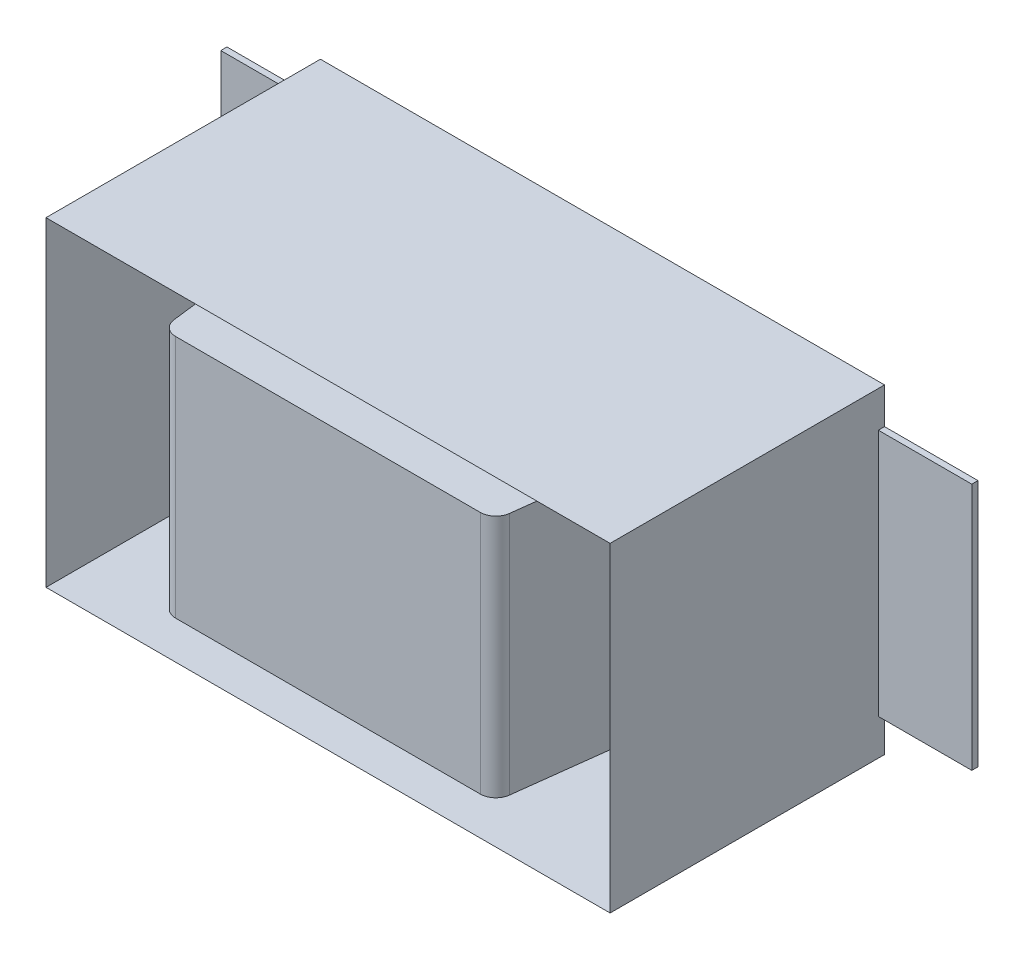
ISO-10303-21;
HEADER;
FILE_DESCRIPTION(('STEP AP214'),'2;1');
FILE_NAME('part.step','',(''),(''),'','','');
FILE_SCHEMA(('AUTOMOTIVE_DESIGN { 1 0 10303 214 1 1 1 1 }'));
ENDSEC;
DATA;
#1=APPLICATION_CONTEXT('core data for automotive mechanical design processes');
#2=APPLICATION_PROTOCOL_DEFINITION('international standard','automotive_design',2000,#1);
#3=PRODUCT_CONTEXT('',#1,'mechanical');
#4=PRODUCT('Part','Part','',(#3));
#5=PRODUCT_RELATED_PRODUCT_CATEGORY('part','',(#4));
#6=PRODUCT_DEFINITION_FORMATION('','',#4);
#7=PRODUCT_DEFINITION_CONTEXT('part definition',#1,'design');
#8=PRODUCT_DEFINITION('design','',#6,#7);
#9=PRODUCT_DEFINITION_SHAPE('','',#8);
#10=(LENGTH_UNIT() NAMED_UNIT(*) SI_UNIT(.MILLI.,.METRE.));
#11=(NAMED_UNIT(*) PLANE_ANGLE_UNIT() SI_UNIT($,.RADIAN.));
#12=(NAMED_UNIT(*) SI_UNIT($,.STERADIAN.) SOLID_ANGLE_UNIT());
#13=UNCERTAINTY_MEASURE_WITH_UNIT(LENGTH_MEASURE(1.E-05),#10,'distance_accuracy_value','');
#14=(GEOMETRIC_REPRESENTATION_CONTEXT(3) GLOBAL_UNCERTAINTY_ASSIGNED_CONTEXT((#13)) GLOBAL_UNIT_ASSIGNED_CONTEXT((#10,
#11,#12)) REPRESENTATION_CONTEXT('',''));
#15=CARTESIAN_POINT('',(0.,0.,0.));
#16=DIRECTION('',(0.,0.,1.));
#17=DIRECTION('',(1.,0.,0.));
#18=AXIS2_PLACEMENT_3D('',#15,#16,#17);
#19=CARTESIAN_POINT('',(1.2314936,0.4065016,0.0762));
#20=DIRECTION('',(0.,1.,0.));
#21=DIRECTION('',(1.,0.,0.));
#22=AXIS2_PLACEMENT_3D('',#19,#20,#21);
#23=PLANE('',#22);
#24=DIRECTION('',(0.,0.,1.));
#25=VECTOR('',#24,1.);
#26=CARTESIAN_POINT('',(0.3424936,0.4065016,0.0762));
#27=LINE('',#26,#25);
#28=CARTESIAN_POINT('',(0.3424936,0.4065016,0.0762));
#29=VERTEX_POINT('',#28);
#30=CARTESIAN_POINT('',(0.3424936,0.4065016,0.09652));
#31=VERTEX_POINT('',#30);
#32=EDGE_CURVE('P0_E326',#29,#31,#27,.T.);
#33=ORIENTED_EDGE('',*,*,#32,.T.);
#34=DIRECTION('',(-1.,0.,0.));
#35=VECTOR('',#34,1.);
#36=CARTESIAN_POINT('',(1.2314936,0.4065016,0.09652));
#37=LINE('',#36,#35);
#38=CARTESIAN_POINT('',(1.2314936,0.4065016,0.09652));
#39=VERTEX_POINT('',#38);
#40=EDGE_CURVE('P0_E285',#39,#31,#37,.T.);
#41=ORIENTED_EDGE('',*,*,#40,.F.);
#42=DIRECTION('',(0.,0.,1.));
#43=VECTOR('',#42,1.);
#44=CARTESIAN_POINT('',(1.2314936,0.4065016,0.0762));
#45=LINE('',#44,#43);
#46=CARTESIAN_POINT('',(1.2314936,0.4065016,0.0762));
#47=VERTEX_POINT('',#46);
#48=EDGE_CURVE('P0_E11',#47,#39,#45,.T.);
#49=ORIENTED_EDGE('',*,*,#48,.F.);
#50=DIRECTION('',(-1.,0.,0.));
#51=VECTOR('',#50,1.);
#52=CARTESIAN_POINT('',(1.2314936,0.4065016,0.0762));
#53=LINE('',#52,#51);
#54=EDGE_CURVE('P0_E259',#47,#29,#53,.T.);
#55=ORIENTED_EDGE('',*,*,#54,.T.);
#56=EDGE_LOOP('',(#33,#41,#49,#55));
#57=FACE_BOUND('',#56,.T.);
#58=ADVANCED_FACE('P0_F17',(#57),#23,.T.);
#59=CARTESIAN_POINT('',(1.2314936,-0.4065016,0.0762));
#60=DIRECTION('',(1.,0.,0.));
#61=DIRECTION('',(0.,1.,0.));
#62=AXIS2_PLACEMENT_3D('',#59,#60,#61);
#63=PLANE('',#62);
#64=ORIENTED_EDGE('',*,*,#48,.T.);
#65=DIRECTION('',(0.,1.,0.));
#66=VECTOR('',#65,1.);
#67=CARTESIAN_POINT('',(1.2314936,-0.4065016,0.09652));
#68=LINE('',#67,#66);
#69=CARTESIAN_POINT('',(1.2314936,-0.4065016,0.09652));
#70=VERTEX_POINT('',#69);
#71=EDGE_CURVE('P0_E290',#70,#39,#68,.T.);
#72=ORIENTED_EDGE('',*,*,#71,.F.);
#73=DIRECTION('',(0.,0.,1.));
#74=VECTOR('',#73,1.);
#75=CARTESIAN_POINT('',(1.2314936,-0.4065016,0.0762));
#76=LINE('',#75,#74);
#77=CARTESIAN_POINT('',(1.2314936,-0.4065016,0.0762));
#78=VERTEX_POINT('',#77);
#79=EDGE_CURVE('P0_E28',#78,#70,#76,.T.);
#80=ORIENTED_EDGE('',*,*,#79,.F.);
#81=DIRECTION('',(0.,1.,0.));
#82=VECTOR('',#81,1.);
#83=CARTESIAN_POINT('',(1.2314936,-0.4065016,0.0762));
#84=LINE('',#83,#82);
#85=EDGE_CURVE('P0_E263',#78,#47,#84,.T.);
#86=ORIENTED_EDGE('',*,*,#85,.T.);
#87=EDGE_LOOP('',(#64,#72,#80,#86));
#88=FACE_BOUND('',#87,.T.);
#89=ADVANCED_FACE('P0_F937',(#88),#63,.T.);
#90=CARTESIAN_POINT('',(0.3424936,-0.4065016,0.0762));
#91=DIRECTION('',(0.,-1.,0.));
#92=DIRECTION('',(0.,0.,-1.));
#93=AXIS2_PLACEMENT_3D('',#90,#91,#92);
#94=PLANE('',#93);
#95=ORIENTED_EDGE('',*,*,#79,.T.);
#96=DIRECTION('',(1.,0.,0.));
#97=VECTOR('',#96,1.);
#98=CARTESIAN_POINT('',(0.3424936,-0.4065016,0.09652));
#99=LINE('',#98,#97);
#100=CARTESIAN_POINT('',(0.3424936,-0.4065016,0.09652));
#101=VERTEX_POINT('',#100);
#102=EDGE_CURVE('P0_E291',#101,#70,#99,.T.);
#103=ORIENTED_EDGE('',*,*,#102,.F.);
#104=DIRECTION('',(0.,0.,1.));
#105=VECTOR('',#104,1.);
#106=CARTESIAN_POINT('',(0.3424936,-0.4065016,0.0762));
#107=LINE('',#106,#105);
#108=CARTESIAN_POINT('',(0.3424936,-0.4065016,0.0762));
#109=VERTEX_POINT('',#108);
#110=EDGE_CURVE('P0_E330',#109,#101,#107,.T.);
#111=ORIENTED_EDGE('',*,*,#110,.F.);
#112=DIRECTION('',(1.,0.,0.));
#113=VECTOR('',#112,1.);
#114=CARTESIAN_POINT('',(0.3424936,-0.4065016,0.0762));
#115=LINE('',#114,#113);
#116=EDGE_CURVE('P0_E383',#109,#78,#115,.T.);
#117=ORIENTED_EDGE('',*,*,#116,.T.);
#118=EDGE_LOOP('',(#95,#103,#111,#117));
#119=FACE_BOUND('',#118,.T.);
#120=ADVANCED_FACE('P0_F922',(#119),#94,.T.);
#121=CARTESIAN_POINT('',(0.3424936,0.4065016,0.0762));
#122=DIRECTION('',(-1.,0.,0.));
#123=DIRECTION('',(0.,0.,1.));
#124=AXIS2_PLACEMENT_3D('',#121,#122,#123);
#125=PLANE('',#124);
#126=DIRECTION('',(0.,-1.,0.));
#127=VECTOR('',#126,1.);
#128=CARTESIAN_POINT('',(0.3424936,0.4065016,0.09652));
#129=LINE('',#128,#127);
#130=CARTESIAN_POINT('',(0.3424936,0.4,0.09652));
#131=VERTEX_POINT('',#130);
#132=EDGE_CURVE('P0_E289',#31,#131,#129,.T.);
#133=ORIENTED_EDGE('',*,*,#132,.F.);
#134=ORIENTED_EDGE('',*,*,#32,.F.);
#135=DIRECTION('',(0.,-1.,0.));
#136=VECTOR('',#135,1.);
#137=CARTESIAN_POINT('',(0.3424936,0.4065016,0.0762));
#138=LINE('',#137,#136);
#139=CARTESIAN_POINT('',(0.3424936,0.4,0.0762));
#140=VERTEX_POINT('',#139);
#141=EDGE_CURVE('P0_E264',#29,#140,#138,.T.);
#142=ORIENTED_EDGE('',*,*,#141,.T.);
#143=DIRECTION('',(0.,0.,1.));
#144=VECTOR('',#143,1.);
#145=CARTESIAN_POINT('',(0.3424936,0.4,0.0762));
#146=LINE('',#145,#144);
#147=EDGE_CURVE('P0_E237',#140,#131,#146,.T.);
#148=ORIENTED_EDGE('',*,*,#147,.T.);
#149=EDGE_LOOP('',(#133,#134,#142,#148));
#150=FACE_BOUND('',#149,.T.);
#151=ADVANCED_FACE('P0_F426',(#150),#125,.T.);
#152=CARTESIAN_POINT('',(0.3424936,0.4065016,0.0762));
#153=DIRECTION('',(-1.,0.,0.));
#154=DIRECTION('',(0.,0.,1.));
#155=AXIS2_PLACEMENT_3D('',#152,#153,#154);
#156=PLANE('',#155);
#157=DIRECTION('',(0.,-1.,0.));
#158=VECTOR('',#157,1.);
#159=CARTESIAN_POINT('',(0.3424936,-0.4,0.0762));
#160=LINE('',#159,#158);
#161=CARTESIAN_POINT('',(0.3424936,-0.4,0.0762));
#162=VERTEX_POINT('',#161);
#163=EDGE_CURVE('P0_E355',#162,#109,#160,.T.);
#164=ORIENTED_EDGE('',*,*,#163,.T.);
#165=ORIENTED_EDGE('',*,*,#110,.T.);
#166=DIRECTION('',(0.,-1.,0.));
#167=VECTOR('',#166,1.);
#168=CARTESIAN_POINT('',(0.3424936,-0.4,0.09652));
#169=LINE('',#168,#167);
#170=CARTESIAN_POINT('',(0.3424936,-0.4,0.09652));
#171=VERTEX_POINT('',#170);
#172=EDGE_CURVE('P0_E295',#171,#101,#169,.T.);
#173=ORIENTED_EDGE('',*,*,#172,.F.);
#174=DIRECTION('',(0.,0.,1.));
#175=VECTOR('',#174,1.);
#176=CARTESIAN_POINT('',(0.3424936,-0.4,0.0762));
#177=LINE('',#176,#175);
#178=EDGE_CURVE('P0_E222',#162,#171,#177,.T.);
#179=ORIENTED_EDGE('',*,*,#178,.F.);
#180=EDGE_LOOP('',(#164,#165,#173,#179));
#181=FACE_BOUND('',#180,.T.);
#182=ADVANCED_FACE('P0_F490',(#181),#156,.T.);
#183=CARTESIAN_POINT('',(-1.2314936,-0.4065016,0.0762));
#184=DIRECTION('',(0.,-1.,0.));
#185=DIRECTION('',(0.,0.,-1.));
#186=AXIS2_PLACEMENT_3D('',#183,#184,#185);
#187=PLANE('',#186);
#188=DIRECTION('',(0.,0.,1.));
#189=VECTOR('',#188,1.);
#190=CARTESIAN_POINT('',(-0.3424936,-0.4065016,0.0762));
#191=LINE('',#190,#189);
#192=CARTESIAN_POINT('',(-0.3424936,-0.4065016,0.0762));
#193=VERTEX_POINT('',#192);
#194=CARTESIAN_POINT('',(-0.3424936,-0.4065016,0.09652));
#195=VERTEX_POINT('',#194);
#196=EDGE_CURVE('P0_E302',#193,#195,#191,.T.);
#197=ORIENTED_EDGE('',*,*,#196,.T.);
#198=DIRECTION('',(1.,0.,0.));
#199=VECTOR('',#198,1.);
#200=CARTESIAN_POINT('',(-1.2314936,-0.4065016,0.09652));
#201=LINE('',#200,#199);
#202=CARTESIAN_POINT('',(-1.2314936,-0.4065016,0.09652));
#203=VERTEX_POINT('',#202);
#204=EDGE_CURVE('P0_E314',#203,#195,#201,.T.);
#205=ORIENTED_EDGE('',*,*,#204,.F.);
#206=DIRECTION('',(0.,0.,1.));
#207=VECTOR('',#206,1.);
#208=CARTESIAN_POINT('',(-1.2314936,-0.4065016,0.0762));
#209=LINE('',#208,#207);
#210=CARTESIAN_POINT('',(-1.2314936,-0.4065016,0.0762));
#211=VERTEX_POINT('',#210);
#212=EDGE_CURVE('P0_E213',#211,#203,#209,.T.);
#213=ORIENTED_EDGE('',*,*,#212,.F.);
#214=DIRECTION('',(1.,0.,0.));
#215=VECTOR('',#214,1.);
#216=CARTESIAN_POINT('',(-1.2314936,-0.4065016,0.0762));
#217=LINE('',#216,#215);
#218=EDGE_CURVE('P0_E346',#211,#193,#217,.T.);
#219=ORIENTED_EDGE('',*,*,#218,.T.);
#220=EDGE_LOOP('',(#197,#205,#213,#219));
#221=FACE_BOUND('',#220,.T.);
#222=ADVANCED_FACE('P0_F1021',(#221),#187,.T.);
#223=CARTESIAN_POINT('',(-1.2314936,0.4065016,0.0762));
#224=DIRECTION('',(-1.,0.,0.));
#225=DIRECTION('',(0.,0.,1.));
#226=AXIS2_PLACEMENT_3D('',#223,#224,#225);
#227=PLANE('',#226);
#228=ORIENTED_EDGE('',*,*,#212,.T.);
#229=DIRECTION('',(0.,-1.,0.));
#230=VECTOR('',#229,1.);
#231=CARTESIAN_POINT('',(-1.2314936,0.4065016,0.09652));
#232=LINE('',#231,#230);
#233=CARTESIAN_POINT('',(-1.2314936,0.4065016,0.09652));
#234=VERTEX_POINT('',#233);
#235=EDGE_CURVE('P0_E359',#234,#203,#232,.T.);
#236=ORIENTED_EDGE('',*,*,#235,.F.);
#237=DIRECTION('',(0.,0.,1.));
#238=VECTOR('',#237,1.);
#239=CARTESIAN_POINT('',(-1.2314936,0.4065016,0.0762));
#240=LINE('',#239,#238);
#241=CARTESIAN_POINT('',(-1.2314936,0.4065016,0.0762));
#242=VERTEX_POINT('',#241);
#243=EDGE_CURVE('P0_E41',#242,#234,#240,.T.);
#244=ORIENTED_EDGE('',*,*,#243,.F.);
#245=DIRECTION('',(0.,-1.,0.));
#246=VECTOR('',#245,1.);
#247=CARTESIAN_POINT('',(-1.2314936,0.4065016,0.0762));
#248=LINE('',#247,#246);
#249=EDGE_CURVE('P0_E338',#242,#211,#248,.T.);
#250=ORIENTED_EDGE('',*,*,#249,.T.);
#251=EDGE_LOOP('',(#228,#236,#244,#250));
#252=FACE_BOUND('',#251,.T.);
#253=ADVANCED_FACE('P0_F1016',(#252),#227,.T.);
#254=CARTESIAN_POINT('',(-0.3424936,0.4065016,0.0762));
#255=DIRECTION('',(0.,1.,0.));
#256=DIRECTION('',(1.,0.,0.));
#257=AXIS2_PLACEMENT_3D('',#254,#255,#256);
#258=PLANE('',#257);
#259=ORIENTED_EDGE('',*,*,#243,.T.);
#260=DIRECTION('',(-1.,0.,0.));
#261=VECTOR('',#260,1.);
#262=CARTESIAN_POINT('',(-0.3424936,0.4065016,0.09652));
#263=LINE('',#262,#261);
#264=CARTESIAN_POINT('',(-0.3424936,0.4065016,0.09652));
#265=VERTEX_POINT('',#264);
#266=EDGE_CURVE('P0_E362',#265,#234,#263,.T.);
#267=ORIENTED_EDGE('',*,*,#266,.F.);
#268=DIRECTION('',(0.,0.,1.));
#269=VECTOR('',#268,1.);
#270=CARTESIAN_POINT('',(-0.3424936,0.4065016,0.0762));
#271=LINE('',#270,#269);
#272=CARTESIAN_POINT('',(-0.3424936,0.4065016,0.0762));
#273=VERTEX_POINT('',#272);
#274=EDGE_CURVE('P0_E307',#273,#265,#271,.T.);
#275=ORIENTED_EDGE('',*,*,#274,.F.);
#276=DIRECTION('',(-1.,0.,0.));
#277=VECTOR('',#276,1.);
#278=CARTESIAN_POINT('',(-0.3424936,0.4065016,0.0762));
#279=LINE('',#278,#277);
#280=EDGE_CURVE('P0_E214',#273,#242,#279,.T.);
#281=ORIENTED_EDGE('',*,*,#280,.T.);
#282=EDGE_LOOP('',(#259,#267,#275,#281));
#283=FACE_BOUND('',#282,.T.);
#284=ADVANCED_FACE('P0_F1002',(#283),#258,.T.);
#285=CARTESIAN_POINT('',(0.8,-0.4,0.0762));
#286=DIRECTION('',(0.,0.,-1.));
#287=DIRECTION('',(0.,-1.,0.));
#288=AXIS2_PLACEMENT_3D('',#285,#286,#287);
#289=PLANE('',#288);
#290=ORIENTED_EDGE('',*,*,#141,.F.);
#291=ORIENTED_EDGE('',*,*,#54,.F.);
#292=ORIENTED_EDGE('',*,*,#85,.F.);
#293=ORIENTED_EDGE('',*,*,#116,.F.);
#294=ORIENTED_EDGE('',*,*,#163,.F.);
#295=DIRECTION('',(-1.,0.,0.));
#296=VECTOR('',#295,1.);
#297=CARTESIAN_POINT('',(0.3424936,-0.4,0.0762));
#298=LINE('',#297,#296);
#299=CARTESIAN_POINT('',(-0.3424936,-0.4,0.0762));
#300=VERTEX_POINT('',#299);
#301=EDGE_CURVE('P0_E227',#162,#300,#298,.T.);
#302=ORIENTED_EDGE('',*,*,#301,.T.);
#303=DIRECTION('',(0.,1.,0.));
#304=VECTOR('',#303,1.);
#305=CARTESIAN_POINT('',(-0.3424936,-0.4065016,0.0762));
#306=LINE('',#305,#304);
#307=EDGE_CURVE('P0_E308',#193,#300,#306,.T.);
#308=ORIENTED_EDGE('',*,*,#307,.F.);
#309=ORIENTED_EDGE('',*,*,#218,.F.);
#310=ORIENTED_EDGE('',*,*,#249,.F.);
#311=ORIENTED_EDGE('',*,*,#280,.F.);
#312=DIRECTION('',(0.,1.,0.));
#313=VECTOR('',#312,1.);
#314=CARTESIAN_POINT('',(-0.3424936,0.4,0.0762));
#315=LINE('',#314,#313);
#316=CARTESIAN_POINT('',(-0.3424936,0.4,0.0762));
#317=VERTEX_POINT('',#316);
#318=EDGE_CURVE('P0_E303',#317,#273,#315,.T.);
#319=ORIENTED_EDGE('',*,*,#318,.F.);
#320=DIRECTION('',(-1.,0.,0.));
#321=VECTOR('',#320,1.);
#322=CARTESIAN_POINT('',(0.3424936,0.4,0.0762));
#323=LINE('',#322,#321);
#324=EDGE_CURVE('P0_E280',#140,#317,#323,.T.);
#325=ORIENTED_EDGE('',*,*,#324,.F.);
#326=EDGE_LOOP('',(#290,#291,#292,#293,#294,#302,#308,#309,#310,#311,#319,#325));
#327=FACE_BOUND('',#326,.T.);
#328=ADVANCED_FACE('P0_F430',(#327),#289,.T.);
#329=CARTESIAN_POINT('',(-0.3424936,-0.4065016,0.0762));
#330=DIRECTION('',(1.,0.,0.));
#331=DIRECTION('',(0.,1.,0.));
#332=AXIS2_PLACEMENT_3D('',#329,#330,#331);
#333=PLANE('',#332);
#334=ORIENTED_EDGE('',*,*,#318,.T.);
#335=ORIENTED_EDGE('',*,*,#274,.T.);
#336=DIRECTION('',(0.,1.,0.));
#337=VECTOR('',#336,1.);
#338=CARTESIAN_POINT('',(-0.3424936,0.4,0.09652));
#339=LINE('',#338,#337);
#340=CARTESIAN_POINT('',(-0.3424936,0.4,0.09652));
#341=VERTEX_POINT('',#340);
#342=EDGE_CURVE('P0_E325',#341,#265,#339,.T.);
#343=ORIENTED_EDGE('',*,*,#342,.F.);
#344=DIRECTION('',(0.,0.,1.));
#345=VECTOR('',#344,1.);
#346=CARTESIAN_POINT('',(-0.3424936,0.4,0.0762));
#347=LINE('',#346,#345);
#348=EDGE_CURVE('P0_E284',#317,#341,#347,.T.);
#349=ORIENTED_EDGE('',*,*,#348,.F.);
#350=EDGE_LOOP('',(#334,#335,#343,#349));
#351=FACE_BOUND('',#350,.T.);
#352=ADVANCED_FACE('P0_F1001',(#351),#333,.T.);
#353=CARTESIAN_POINT('',(-0.3424936,-0.4065016,0.0762));
#354=DIRECTION('',(1.,0.,0.));
#355=DIRECTION('',(0.,1.,0.));
#356=AXIS2_PLACEMENT_3D('',#353,#354,#355);
#357=PLANE('',#356);
#358=DIRECTION('',(0.,1.,0.));
#359=VECTOR('',#358,1.);
#360=CARTESIAN_POINT('',(-0.3424936,-0.4065016,0.09652));
#361=LINE('',#360,#359);
#362=CARTESIAN_POINT('',(-0.3424936,-0.4,0.09652));
#363=VERTEX_POINT('',#362);
#364=EDGE_CURVE('P0_E255',#195,#363,#361,.T.);
#365=ORIENTED_EDGE('',*,*,#364,.F.);
#366=ORIENTED_EDGE('',*,*,#196,.F.);
#367=ORIENTED_EDGE('',*,*,#307,.T.);
#368=DIRECTION('',(0.,0.,1.));
#369=VECTOR('',#368,1.);
#370=CARTESIAN_POINT('',(-0.3424936,-0.4,0.0762));
#371=LINE('',#370,#369);
#372=EDGE_CURVE('P0_E242',#300,#363,#371,.T.);
#373=ORIENTED_EDGE('',*,*,#372,.T.);
#374=EDGE_LOOP('',(#365,#366,#367,#373));
#375=FACE_BOUND('',#374,.T.);
#376=ADVANCED_FACE('P0_F19',(#375),#357,.T.);
#377=CARTESIAN_POINT('',(0.,0.4,0.0762));
#378=DIRECTION('',(0.,1.,0.));
#379=DIRECTION('',(1.,0.,0.));
#380=AXIS2_PLACEMENT_3D('',#377,#378,#379);
#381=PLANE('',#380);
#382=ORIENTED_EDGE('',*,*,#147,.F.);
#383=ORIENTED_EDGE('',*,*,#324,.T.);
#384=ORIENTED_EDGE('',*,*,#348,.T.);
#385=DIRECTION('',(-1.,0.,0.));
#386=VECTOR('',#385,1.);
#387=CARTESIAN_POINT('',(-0.3424936,0.4,0.09652));
#388=LINE('',#387,#386);
#389=CARTESIAN_POINT('',(-0.8,0.4,0.09652));
#390=VERTEX_POINT('',#389);
#391=EDGE_CURVE('P0_E321',#341,#390,#388,.T.);
#392=ORIENTED_EDGE('',*,*,#391,.T.);
#393=DIRECTION('',(0.,0.,1.));
#394=VECTOR('',#393,1.);
#395=CARTESIAN_POINT('',(-0.8,0.4,0.09652));
#396=LINE('',#395,#394);
#397=CARTESIAN_POINT('',(-0.8,0.4,0.5262));
#398=VERTEX_POINT('',#397);
#399=EDGE_CURVE('P0_E234',#390,#398,#396,.T.);
#400=ORIENTED_EDGE('',*,*,#399,.T.);
#401=DIRECTION('',(1.,0.,0.));
#402=VECTOR('',#401,1.);
#403=CARTESIAN_POINT('',(-0.8,0.4,0.5262));
#404=LINE('',#403,#402);
#405=CARTESIAN_POINT('',(-0.6,0.4,0.5262));
#406=VERTEX_POINT('',#405);
#407=EDGE_CURVE('P0_E269',#398,#406,#404,.T.);
#408=ORIENTED_EDGE('',*,*,#407,.T.);
#409=DIRECTION('',(0.122402128164196,0.,0.992480588737571));
#410=VECTOR('',#409,1.);
#411=CARTESIAN_POINT('',(-0.6,0.4,0.5262));
#412=LINE('',#411,#410);
#413=CARTESIAN_POINT('',(-0.55,0.4,0.9316180281107));
#414=VERTEX_POINT('',#413);
#415=EDGE_CURVE('P0_E270',#406,#414,#412,.T.);
#416=ORIENTED_EDGE('',*,*,#415,.T.);
#417=CARTESIAN_POINT('',(-0.4995819860921,0.4,0.9254));
#418=DIRECTION('',(0.,1.,0.));
#419=DIRECTION('',(-0.992480588737571,0.,0.122402128164196));
#420=AXIS2_PLACEMENT_3D('',#417,#418,#419);
#421=CIRCLE('',#420,0.0508);
#422=CARTESIAN_POINT('',(-0.4995819860921,0.4,0.9762));
#423=VERTEX_POINT('',#422);
#424=EDGE_CURVE('P0_E179',#414,#423,#421,.T.);
#425=ORIENTED_EDGE('',*,*,#424,.T.);
#426=DIRECTION('',(1.,0.,0.));
#427=VECTOR('',#426,1.);
#428=CARTESIAN_POINT('',(-0.4995819860921,0.4,0.9762));
#429=LINE('',#428,#427);
#430=CARTESIAN_POINT('',(0.4995819860921,0.4,0.9762));
#431=VERTEX_POINT('',#430);
#432=EDGE_CURVE('P0_E170',#423,#431,#429,.T.);
#433=ORIENTED_EDGE('',*,*,#432,.T.);
#434=CARTESIAN_POINT('',(0.4995819860921,0.4,0.9254));
#435=DIRECTION('',(0.,1.,0.));
#436=DIRECTION('',(0.,0.,1.));
#437=AXIS2_PLACEMENT_3D('',#434,#435,#436);
#438=CIRCLE('',#437,0.0508);
#439=CARTESIAN_POINT('',(0.55,0.4,0.9316180281107));
#440=VERTEX_POINT('',#439);
#441=EDGE_CURVE('P0_E176',#431,#440,#438,.T.);
#442=ORIENTED_EDGE('',*,*,#441,.T.);
#443=DIRECTION('',(0.122402128164196,0.,-0.992480588737571));
#444=VECTOR('',#443,1.);
#445=CARTESIAN_POINT('',(0.55,0.4,0.9316180281107));
#446=LINE('',#445,#444);
#447=CARTESIAN_POINT('',(0.6,0.4,0.5262));
#448=VERTEX_POINT('',#447);
#449=EDGE_CURVE('P0_E207',#440,#448,#446,.T.);
#450=ORIENTED_EDGE('',*,*,#449,.T.);
#451=DIRECTION('',(1.,0.,0.));
#452=VECTOR('',#451,1.);
#453=CARTESIAN_POINT('',(0.6,0.4,0.5262));
#454=LINE('',#453,#452);
#455=CARTESIAN_POINT('',(0.8,0.4,0.5262));
#456=VERTEX_POINT('',#455);
#457=EDGE_CURVE('P0_E232',#448,#456,#454,.T.);
#458=ORIENTED_EDGE('',*,*,#457,.T.);
#459=DIRECTION('',(0.,0.,-1.));
#460=VECTOR('',#459,1.);
#461=CARTESIAN_POINT('',(0.8,0.4,0.5262));
#462=LINE('',#461,#460);
#463=CARTESIAN_POINT('',(0.8,0.4,0.09652));
#464=VERTEX_POINT('',#463);
#465=EDGE_CURVE('P0_E233',#456,#464,#462,.T.);
#466=ORIENTED_EDGE('',*,*,#465,.T.);
#467=DIRECTION('',(-1.,0.,0.));
#468=VECTOR('',#467,1.);
#469=CARTESIAN_POINT('',(0.8,0.4,0.09652));
#470=LINE('',#469,#468);
#471=EDGE_CURVE('P0_E252',#464,#131,#470,.T.);
#472=ORIENTED_EDGE('',*,*,#471,.T.);
#473=EDGE_LOOP('',(#382,#383,#384,#392,#400,#408,#416,#425,#433,#442,#450,#458,#466,#472));
#474=FACE_BOUND('',#473,.T.);
#475=ADVANCED_FACE('P0_F173',(#474),#381,.T.);
#476=CARTESIAN_POINT('',(-0.8,-0.4,0.0762));
#477=DIRECTION('',(-1.,0.,0.));
#478=DIRECTION('',(0.,0.,1.));
#479=AXIS2_PLACEMENT_3D('',#476,#477,#478);
#480=PLANE('',#479);
#481=DIRECTION('',(0.,0.,1.));
#482=VECTOR('',#481,1.);
#483=CARTESIAN_POINT('',(-0.8,-0.4,0.09652));
#484=LINE('',#483,#482);
#485=CARTESIAN_POINT('',(-0.8,-0.4,0.09652));
#486=VERTEX_POINT('',#485);
#487=CARTESIAN_POINT('',(-0.8,-0.4,0.5262));
#488=VERTEX_POINT('',#487);
#489=EDGE_CURVE('P0_E21',#486,#488,#484,.T.);
#490=ORIENTED_EDGE('',*,*,#489,.T.);
#491=DIRECTION('',(0.,1.,0.));
#492=VECTOR('',#491,1.);
#493=CARTESIAN_POINT('',(-0.8,-0.4,0.5262));
#494=LINE('',#493,#492);
#495=EDGE_CURVE('P0_E238',#488,#398,#494,.T.);
#496=ORIENTED_EDGE('',*,*,#495,.T.);
#497=ORIENTED_EDGE('',*,*,#399,.F.);
#498=DIRECTION('',(0.,1.,0.));
#499=VECTOR('',#498,1.);
#500=CARTESIAN_POINT('',(-0.8,-0.4,0.09652));
#501=LINE('',#500,#499);
#502=EDGE_CURVE('P0_E251',#486,#390,#501,.T.);
#503=ORIENTED_EDGE('',*,*,#502,.F.);
#504=EDGE_LOOP('',(#490,#496,#497,#503));
#505=FACE_BOUND('',#504,.T.);
#506=ADVANCED_FACE('P0_F515',(#505),#480,.T.);
#507=CARTESIAN_POINT('',(-0.8,-0.4,0.5262));
#508=DIRECTION('',(0.,0.,1.));
#509=DIRECTION('',(1.,0.,0.));
#510=AXIS2_PLACEMENT_3D('',#507,#508,#509);
#511=PLANE('',#510);
#512=DIRECTION('',(0.,1.,0.));
#513=VECTOR('',#512,1.);
#514=CARTESIAN_POINT('',(-0.6,-0.4,0.5262));
#515=LINE('',#514,#513);
#516=CARTESIAN_POINT('',(-0.6,-0.4,0.5262));
#517=VERTEX_POINT('',#516);
#518=EDGE_CURVE('P0_E265',#517,#406,#515,.T.);
#519=ORIENTED_EDGE('',*,*,#518,.T.);
#520=ORIENTED_EDGE('',*,*,#407,.F.);
#521=ORIENTED_EDGE('',*,*,#495,.F.);
#522=DIRECTION('',(1.,0.,0.));
#523=VECTOR('',#522,1.);
#524=CARTESIAN_POINT('',(-0.8,-0.4,0.5262));
#525=LINE('',#524,#523);
#526=EDGE_CURVE('P0_E243',#488,#517,#525,.T.);
#527=ORIENTED_EDGE('',*,*,#526,.T.);
#528=EDGE_LOOP('',(#519,#520,#521,#527));
#529=FACE_BOUND('',#528,.T.);
#530=ADVANCED_FACE('P0_F520',(#529),#511,.T.);
#531=CARTESIAN_POINT('',(-0.6,-0.4,0.5262));
#532=DIRECTION('',(-0.992480588737571,0.,0.122402128164196));
#533=DIRECTION('',(0.,1.,0.));
#534=AXIS2_PLACEMENT_3D('',#531,#532,#533);
#535=PLANE('',#534);
#536=DIRECTION('',(0.,1.,0.));
#537=VECTOR('',#536,1.);
#538=CARTESIAN_POINT('',(-0.55,-0.4,0.9316180281107));
#539=LINE('',#538,#537);
#540=CARTESIAN_POINT('',(-0.55,-0.4,0.9316180281107));
#541=VERTEX_POINT('',#540);
#542=EDGE_CURVE('P0_E374',#541,#414,#539,.T.);
#543=ORIENTED_EDGE('',*,*,#542,.T.);
#544=ORIENTED_EDGE('',*,*,#415,.F.);
#545=ORIENTED_EDGE('',*,*,#518,.F.);
#546=DIRECTION('',(0.122402128164196,0.,0.992480588737571));
#547=VECTOR('',#546,1.);
#548=CARTESIAN_POINT('',(-0.6,-0.4,0.5262));
#549=LINE('',#548,#547);
#550=EDGE_CURVE('P0_E221',#517,#541,#549,.T.);
#551=ORIENTED_EDGE('',*,*,#550,.T.);
#552=EDGE_LOOP('',(#543,#544,#545,#551));
#553=FACE_BOUND('',#552,.T.);
#554=ADVANCED_FACE('P0_F968',(#553),#535,.T.);
#555=CARTESIAN_POINT('',(-0.4995819860921,-0.4,0.9254));
#556=DIRECTION('',(0.,1.,0.));
#557=DIRECTION('',(-1.,0.,0.));
#558=AXIS2_PLACEMENT_3D('',#555,#556,#557);
#559=CYLINDRICAL_SURFACE('',#558,0.0508);
#560=DIRECTION('',(0.,1.,0.));
#561=VECTOR('',#560,1.);
#562=CARTESIAN_POINT('',(-0.4995819860921,-0.4,0.9762));
#563=LINE('',#562,#561);
#564=CARTESIAN_POINT('',(-0.4995819860921,-0.4,0.9762));
#565=VERTEX_POINT('',#564);
#566=EDGE_CURVE('P0_E183',#565,#423,#563,.T.);
#567=ORIENTED_EDGE('',*,*,#566,.T.);
#568=ORIENTED_EDGE('',*,*,#424,.F.);
#569=ORIENTED_EDGE('',*,*,#542,.F.);
#570=CARTESIAN_POINT('',(-0.4995819860921,-0.4,0.9254));
#571=DIRECTION('',(0.,1.,0.));
#572=DIRECTION('',(-0.992480588737571,0.,0.122402128164196));
#573=AXIS2_PLACEMENT_3D('',#570,#571,#572);
#574=CIRCLE('',#573,0.0508);
#575=EDGE_CURVE('P0_E217',#541,#565,#574,.T.);
#576=ORIENTED_EDGE('',*,*,#575,.T.);
#577=EDGE_LOOP('',(#567,#568,#569,#576));
#578=FACE_BOUND('',#577,.T.);
#579=ADVANCED_FACE('P0_F987',(#578),#559,.T.);
#580=CARTESIAN_POINT('',(-0.4995819860921,-0.4,0.9762));
#581=DIRECTION('',(0.,0.,1.));
#582=DIRECTION('',(1.,0.,0.));
#583=AXIS2_PLACEMENT_3D('',#580,#581,#582);
#584=PLANE('',#583);
#585=DIRECTION('',(0.,1.,0.));
#586=VECTOR('',#585,1.);
#587=CARTESIAN_POINT('',(0.4995819860921,-0.4,0.9762));
#588=LINE('',#587,#586);
#589=CARTESIAN_POINT('',(0.4995819860921,-0.4,0.9762));
#590=VERTEX_POINT('',#589);
#591=EDGE_CURVE('P0_E184',#590,#431,#588,.T.);
#592=ORIENTED_EDGE('',*,*,#591,.T.);
#593=ORIENTED_EDGE('',*,*,#432,.F.);
#594=ORIENTED_EDGE('',*,*,#566,.F.);
#595=DIRECTION('',(1.,0.,0.));
#596=VECTOR('',#595,1.);
#597=CARTESIAN_POINT('',(-0.4995819860921,-0.4,0.9762));
#598=LINE('',#597,#596);
#599=EDGE_CURVE('P0_E189',#565,#590,#598,.T.);
#600=ORIENTED_EDGE('',*,*,#599,.T.);
#601=EDGE_LOOP('',(#592,#593,#594,#600));
#602=FACE_BOUND('',#601,.T.);
#603=ADVANCED_FACE('P0_F187',(#602),#584,.T.);
#604=CARTESIAN_POINT('',(0.4995819860921,-0.4,0.9254));
#605=DIRECTION('',(0.,1.,0.));
#606=DIRECTION('',(-1.,0.,0.));
#607=AXIS2_PLACEMENT_3D('',#604,#605,#606);
#608=CYLINDRICAL_SURFACE('',#607,0.0508);
#609=DIRECTION('',(0.,1.,0.));
#610=VECTOR('',#609,1.);
#611=CARTESIAN_POINT('',(0.55,-0.4,0.9316180281107));
#612=LINE('',#611,#610);
#613=CARTESIAN_POINT('',(0.55,-0.4,0.9316180281107));
#614=VERTEX_POINT('',#613);
#615=EDGE_CURVE('P0_E197',#614,#440,#612,.T.);
#616=ORIENTED_EDGE('',*,*,#615,.T.);
#617=ORIENTED_EDGE('',*,*,#441,.F.);
#618=ORIENTED_EDGE('',*,*,#591,.F.);
#619=CARTESIAN_POINT('',(0.4995819860921,-0.4,0.9254));
#620=DIRECTION('',(0.,1.,0.));
#621=DIRECTION('',(0.,0.,1.));
#622=AXIS2_PLACEMENT_3D('',#619,#620,#621);
#623=CIRCLE('',#622,0.0508);
#624=EDGE_CURVE('P0_E370',#590,#614,#623,.T.);
#625=ORIENTED_EDGE('',*,*,#624,.T.);
#626=EDGE_LOOP('',(#616,#617,#618,#625));
#627=FACE_BOUND('',#626,.T.);
#628=ADVANCED_FACE('P0_F195',(#627),#608,.T.);
#629=CARTESIAN_POINT('',(0.55,-0.4,0.9316180281107));
#630=DIRECTION('',(0.992480588737571,0.,0.122402128164196));
#631=DIRECTION('',(0.,-1.,0.));
#632=AXIS2_PLACEMENT_3D('',#629,#630,#631);
#633=PLANE('',#632);
#634=DIRECTION('',(0.,1.,0.));
#635=VECTOR('',#634,1.);
#636=CARTESIAN_POINT('',(0.6,-0.4,0.5262));
#637=LINE('',#636,#635);
#638=CARTESIAN_POINT('',(0.6,-0.4,0.5262));
#639=VERTEX_POINT('',#638);
#640=EDGE_CURVE('P0_E258',#639,#448,#637,.T.);
#641=ORIENTED_EDGE('',*,*,#640,.T.);
#642=ORIENTED_EDGE('',*,*,#449,.F.);
#643=ORIENTED_EDGE('',*,*,#615,.F.);
#644=DIRECTION('',(0.122402128164196,0.,-0.992480588737571));
#645=VECTOR('',#644,1.);
#646=CARTESIAN_POINT('',(0.55,-0.4,0.9316180281107));
#647=LINE('',#646,#645);
#648=EDGE_CURVE('P0_E275',#614,#639,#647,.T.);
#649=ORIENTED_EDGE('',*,*,#648,.T.);
#650=EDGE_LOOP('',(#641,#642,#643,#649));
#651=FACE_BOUND('',#650,.T.);
#652=ADVANCED_FACE('P0_F480',(#651),#633,.T.);
#653=CARTESIAN_POINT('',(0.6,-0.4,0.5262));
#654=DIRECTION('',(0.,0.,1.));
#655=DIRECTION('',(1.,0.,0.));
#656=AXIS2_PLACEMENT_3D('',#653,#654,#655);
#657=PLANE('',#656);
#658=DIRECTION('',(0.,1.,0.));
#659=VECTOR('',#658,1.);
#660=CARTESIAN_POINT('',(0.8,-0.4,0.5262));
#661=LINE('',#660,#659);
#662=CARTESIAN_POINT('',(0.8,-0.4,0.5262));
#663=VERTEX_POINT('',#662);
#664=EDGE_CURVE('P0_E228',#663,#456,#661,.T.);
#665=ORIENTED_EDGE('',*,*,#664,.T.);
#666=ORIENTED_EDGE('',*,*,#457,.F.);
#667=ORIENTED_EDGE('',*,*,#640,.F.);
#668=DIRECTION('',(1.,0.,0.));
#669=VECTOR('',#668,1.);
#670=CARTESIAN_POINT('',(0.6,-0.4,0.5262));
#671=LINE('',#670,#669);
#672=EDGE_CURVE('P0_E271',#639,#663,#671,.T.);
#673=ORIENTED_EDGE('',*,*,#672,.T.);
#674=EDGE_LOOP('',(#665,#666,#667,#673));
#675=FACE_BOUND('',#674,.T.);
#676=ADVANCED_FACE('P0_F475',(#675),#657,.T.);
#677=CARTESIAN_POINT('',(0.8,-0.4,0.5262));
#678=DIRECTION('',(1.,0.,0.));
#679=DIRECTION('',(0.,1.,0.));
#680=AXIS2_PLACEMENT_3D('',#677,#678,#679);
#681=PLANE('',#680);
#682=ORIENTED_EDGE('',*,*,#465,.F.);
#683=ORIENTED_EDGE('',*,*,#664,.F.);
#684=DIRECTION('',(0.,0.,-1.));
#685=VECTOR('',#684,1.);
#686=CARTESIAN_POINT('',(0.8,-0.4,0.5262));
#687=LINE('',#686,#685);
#688=CARTESIAN_POINT('',(0.8,-0.4,0.09652));
#689=VERTEX_POINT('',#688);
#690=EDGE_CURVE('P0_E276',#663,#689,#687,.T.);
#691=ORIENTED_EDGE('',*,*,#690,.T.);
#692=DIRECTION('',(0.,1.,0.));
#693=VECTOR('',#692,1.);
#694=CARTESIAN_POINT('',(0.8,-0.4,0.09652));
#695=LINE('',#694,#693);
#696=EDGE_CURVE('P0_E247',#689,#464,#695,.T.);
#697=ORIENTED_EDGE('',*,*,#696,.T.);
#698=EDGE_LOOP('',(#682,#683,#691,#697));
#699=FACE_BOUND('',#698,.T.);
#700=ADVANCED_FACE('P0_F485',(#699),#681,.T.);
#701=CARTESIAN_POINT('',(0.,0.,0.09652));
#702=DIRECTION('',(0.,0.,1.));
#703=DIRECTION('',(1.,0.,0.));
#704=AXIS2_PLACEMENT_3D('',#701,#702,#703);
#705=PLANE('',#704);
#706=ORIENTED_EDGE('',*,*,#502,.T.);
#707=ORIENTED_EDGE('',*,*,#391,.F.);
#708=ORIENTED_EDGE('',*,*,#342,.T.);
#709=ORIENTED_EDGE('',*,*,#266,.T.);
#710=ORIENTED_EDGE('',*,*,#235,.T.);
#711=ORIENTED_EDGE('',*,*,#204,.T.);
#712=ORIENTED_EDGE('',*,*,#364,.T.);
#713=DIRECTION('',(-1.,0.,0.));
#714=VECTOR('',#713,1.);
#715=CARTESIAN_POINT('',(-0.3424936,-0.4,0.09652));
#716=LINE('',#715,#714);
#717=EDGE_CURVE('P0_E402',#363,#486,#716,.T.);
#718=ORIENTED_EDGE('',*,*,#717,.T.);
#719=EDGE_LOOP('',(#706,#707,#708,#709,#710,#711,#712,#718));
#720=FACE_BOUND('',#719,.T.);
#721=ADVANCED_FACE('P0_F524',(#720),#705,.T.);
#722=CARTESIAN_POINT('',(0.,0.,0.09652));
#723=DIRECTION('',(0.,0.,1.));
#724=DIRECTION('',(1.,0.,0.));
#725=AXIS2_PLACEMENT_3D('',#722,#723,#724);
#726=PLANE('',#725);
#727=ORIENTED_EDGE('',*,*,#172,.T.);
#728=ORIENTED_EDGE('',*,*,#102,.T.);
#729=ORIENTED_EDGE('',*,*,#71,.T.);
#730=ORIENTED_EDGE('',*,*,#40,.T.);
#731=ORIENTED_EDGE('',*,*,#132,.T.);
#732=ORIENTED_EDGE('',*,*,#471,.F.);
#733=ORIENTED_EDGE('',*,*,#696,.F.);
#734=DIRECTION('',(-1.,0.,0.));
#735=VECTOR('',#734,1.);
#736=CARTESIAN_POINT('',(0.8,-0.4,0.09652));
#737=LINE('',#736,#735);
#738=EDGE_CURVE('P0_E226',#689,#171,#737,.T.);
#739=ORIENTED_EDGE('',*,*,#738,.T.);
#740=EDGE_LOOP('',(#727,#728,#729,#730,#731,#732,#733,#739));
#741=FACE_BOUND('',#740,.T.);
#742=ADVANCED_FACE('P0_F439',(#741),#726,.T.);
#743=CARTESIAN_POINT('',(0.,-0.4,0.0762));
#744=DIRECTION('',(0.,1.,0.));
#745=DIRECTION('',(1.,0.,0.));
#746=AXIS2_PLACEMENT_3D('',#743,#744,#745);
#747=PLANE('',#746);
#748=ORIENTED_EDGE('',*,*,#690,.F.);
#749=ORIENTED_EDGE('',*,*,#672,.F.);
#750=ORIENTED_EDGE('',*,*,#648,.F.);
#751=ORIENTED_EDGE('',*,*,#624,.F.);
#752=ORIENTED_EDGE('',*,*,#599,.F.);
#753=ORIENTED_EDGE('',*,*,#575,.F.);
#754=ORIENTED_EDGE('',*,*,#550,.F.);
#755=ORIENTED_EDGE('',*,*,#526,.F.);
#756=ORIENTED_EDGE('',*,*,#489,.F.);
#757=ORIENTED_EDGE('',*,*,#717,.F.);
#758=ORIENTED_EDGE('',*,*,#372,.F.);
#759=ORIENTED_EDGE('',*,*,#301,.F.);
#760=ORIENTED_EDGE('',*,*,#178,.T.);
#761=ORIENTED_EDGE('',*,*,#738,.F.);
#762=EDGE_LOOP('',(#748,#749,#750,#751,#752,#753,#754,#755,#756,#757,#758,#759,#760,#761));
#763=FACE_BOUND('',#762,.T.);
#764=ADVANCED_FACE('P0_F482',(#763),#747,.F.);
#765=CLOSED_SHELL('',(#58,#89,#120,#151,#182,#222,#253,#284,#328,#352,#376,#475,#506,#530,#554,
#579,#603,#628,#652,#676,#700,#721,#742,#764));
#766=MANIFOLD_SOLID_BREP('P0_B1',#765);
#767=CARTESIAN_POINT('',(0.925,0.525,0.0762));
#768=DIRECTION('',(0.,1.,0.));
#769=DIRECTION('',(1.,0.,0.));
#770=AXIS2_PLACEMENT_3D('',#767,#768,#769);
#771=PLANE('',#770);
#772=CARTESIAN_POINT('',(0.925,0.525,0.9762));
#773=DIRECTION('',(0.,0.,-1.));
#774=VECTOR('',#773,1.);
#775=LINE('',#772,#774);
#776=CARTESIAN_POINT('',(0.925,0.525,0.9762));
#777=VERTEX_POINT('',#776);
#778=CARTESIAN_POINT('',(0.925,0.525,0.0762));
#779=VERTEX_POINT('',#778);
#780=EDGE_CURVE('P1_E29',#777,#779,#775,.T.);
#781=ORIENTED_EDGE('',*,*,#780,.T.);
#782=CARTESIAN_POINT('',(0.925,0.525,0.0762));
#783=DIRECTION('',(-1.,0.,0.));
#784=VECTOR('',#783,1.);
#785=LINE('',#782,#784);
#786=CARTESIAN_POINT('',(-0.925,0.525,0.0762));
#787=VERTEX_POINT('',#786);
#788=EDGE_CURVE('P1_E11',#779,#787,#785,.T.);
#789=ORIENTED_EDGE('',*,*,#788,.T.);
#790=CARTESIAN_POINT('',(-0.925,0.525,0.0762));
#791=DIRECTION('',(0.,0.,1.));
#792=VECTOR('',#791,1.);
#793=LINE('',#790,#792);
#794=CARTESIAN_POINT('',(-0.925,0.525,0.9762));
#795=VERTEX_POINT('',#794);
#796=EDGE_CURVE('P1_E79',#787,#795,#793,.T.);
#797=ORIENTED_EDGE('',*,*,#796,.T.);
#798=CARTESIAN_POINT('',(-0.925,0.525,0.9762));
#799=DIRECTION('',(1.,0.,0.));
#800=VECTOR('',#799,1.);
#801=LINE('',#798,#800);
#802=EDGE_CURVE('P1_E122',#795,#777,#801,.T.);
#803=ORIENTED_EDGE('',*,*,#802,.T.);
#804=EDGE_LOOP('',(#781,#789,#797,#803));
#805=FACE_BOUND('',#804,.T.);
#806=ADVANCED_FACE('P1_F18',(#805),#771,.T.);
#807=CARTESIAN_POINT('',(0.925,-0.525,0.0762));
#808=DIRECTION('',(1.,0.,0.));
#809=DIRECTION('',(0.,1.,0.));
#810=AXIS2_PLACEMENT_3D('',#807,#808,#809);
#811=PLANE('',#810);
#812=CARTESIAN_POINT('',(0.925,-0.525,0.9762));
#813=DIRECTION('',(0.,0.,-1.));
#814=VECTOR('',#813,1.);
#815=LINE('',#812,#814);
#816=CARTESIAN_POINT('',(0.925,-0.525,0.9762));
#817=VERTEX_POINT('',#816);
#818=CARTESIAN_POINT('',(0.925,-0.525,0.0762));
#819=VERTEX_POINT('',#818);
#820=EDGE_CURVE('P1_E190',#817,#819,#815,.T.);
#821=ORIENTED_EDGE('',*,*,#820,.T.);
#822=CARTESIAN_POINT('',(0.925,-0.525,0.0762));
#823=DIRECTION('',(0.,1.,0.));
#824=VECTOR('',#823,1.);
#825=LINE('',#822,#824);
#826=EDGE_CURVE('P1_E37',#819,#779,#825,.T.);
#827=ORIENTED_EDGE('',*,*,#826,.T.);
#828=ORIENTED_EDGE('',*,*,#780,.F.);
#829=CARTESIAN_POINT('',(0.925,0.525,0.9762));
#830=DIRECTION('',(0.,-1.,0.));
#831=VECTOR('',#830,1.);
#832=LINE('',#829,#831);
#833=EDGE_CURVE('P1_E82',#777,#817,#832,.T.);
#834=ORIENTED_EDGE('',*,*,#833,.T.);
#835=EDGE_LOOP('',(#821,#827,#828,#834));
#836=FACE_BOUND('',#835,.T.);
#837=ADVANCED_FACE('P1_F99',(#836),#811,.T.);
#838=CARTESIAN_POINT('',(-0.925,0.525,0.0762));
#839=DIRECTION('',(-1.,0.,0.));
#840=DIRECTION('',(0.,0.,1.));
#841=AXIS2_PLACEMENT_3D('',#838,#839,#840);
#842=PLANE('',#841);
#843=ORIENTED_EDGE('',*,*,#796,.F.);
#844=CARTESIAN_POINT('',(-0.925,0.525,0.0762));
#845=DIRECTION('',(0.,-1.,0.));
#846=VECTOR('',#845,1.);
#847=LINE('',#844,#846);
#848=CARTESIAN_POINT('',(-0.925,-0.525,0.0762));
#849=VERTEX_POINT('',#848);
#850=EDGE_CURVE('P1_E75',#787,#849,#847,.T.);
#851=ORIENTED_EDGE('',*,*,#850,.T.);
#852=CARTESIAN_POINT('',(-0.925,-0.525,0.0762));
#853=DIRECTION('',(0.,0.,1.));
#854=VECTOR('',#853,1.);
#855=LINE('',#852,#854);
#856=CARTESIAN_POINT('',(-0.925,-0.525,0.9762));
#857=VERTEX_POINT('',#856);
#858=EDGE_CURVE('P1_E61',#849,#857,#855,.T.);
#859=ORIENTED_EDGE('',*,*,#858,.T.);
#860=CARTESIAN_POINT('',(-0.925,-0.525,0.9762));
#861=DIRECTION('',(0.,1.,0.));
#862=VECTOR('',#861,1.);
#863=LINE('',#860,#862);
#864=EDGE_CURVE('P1_E70',#857,#795,#863,.T.);
#865=ORIENTED_EDGE('',*,*,#864,.T.);
#866=EDGE_LOOP('',(#843,#851,#859,#865));
#867=FACE_BOUND('',#866,.T.);
#868=ADVANCED_FACE('P1_F77',(#867),#842,.T.);
#869=CARTESIAN_POINT('',(-0.925,-0.525,0.0762));
#870=DIRECTION('',(0.,-1.,0.));
#871=DIRECTION('',(0.,0.,-1.));
#872=AXIS2_PLACEMENT_3D('',#869,#870,#871);
#873=PLANE('',#872);
#874=ORIENTED_EDGE('',*,*,#858,.F.);
#875=CARTESIAN_POINT('',(-0.925,-0.525,0.0762));
#876=DIRECTION('',(1.,0.,0.));
#877=VECTOR('',#876,1.);
#878=LINE('',#875,#877);
#879=EDGE_CURVE('P1_E64',#849,#819,#878,.T.);
#880=ORIENTED_EDGE('',*,*,#879,.T.);
#881=ORIENTED_EDGE('',*,*,#820,.F.);
#882=CARTESIAN_POINT('',(0.925,-0.525,0.9762));
#883=DIRECTION('',(-1.,0.,0.));
#884=VECTOR('',#883,1.);
#885=LINE('',#882,#884);
#886=EDGE_CURVE('P1_E58',#817,#857,#885,.T.);
#887=ORIENTED_EDGE('',*,*,#886,.T.);
#888=EDGE_LOOP('',(#874,#880,#881,#887));
#889=FACE_BOUND('',#888,.T.);
#890=ADVANCED_FACE('P1_F19',(#889),#873,.T.);
#891=OPEN_SHELL('',(#806,#837,#868,#890));
#892=SHELL_BASED_SURFACE_MODEL('P1_B1',(#891));
#893=ADVANCED_BREP_SHAPE_REPRESENTATION('',(#18,#766),#14);
#894=MANIFOLD_SURFACE_SHAPE_REPRESENTATION('',(#18,#892),#14);
#895=SHAPE_REPRESENTATION('',(#18),#14);
#896=SHAPE_DEFINITION_REPRESENTATION(#9,#895);
#897=SHAPE_REPRESENTATION_RELATIONSHIP('','',#895,#893);
#898=SHAPE_REPRESENTATION_RELATIONSHIP('','',#895,#894);
ENDSEC;
END-ISO-10303-21;
